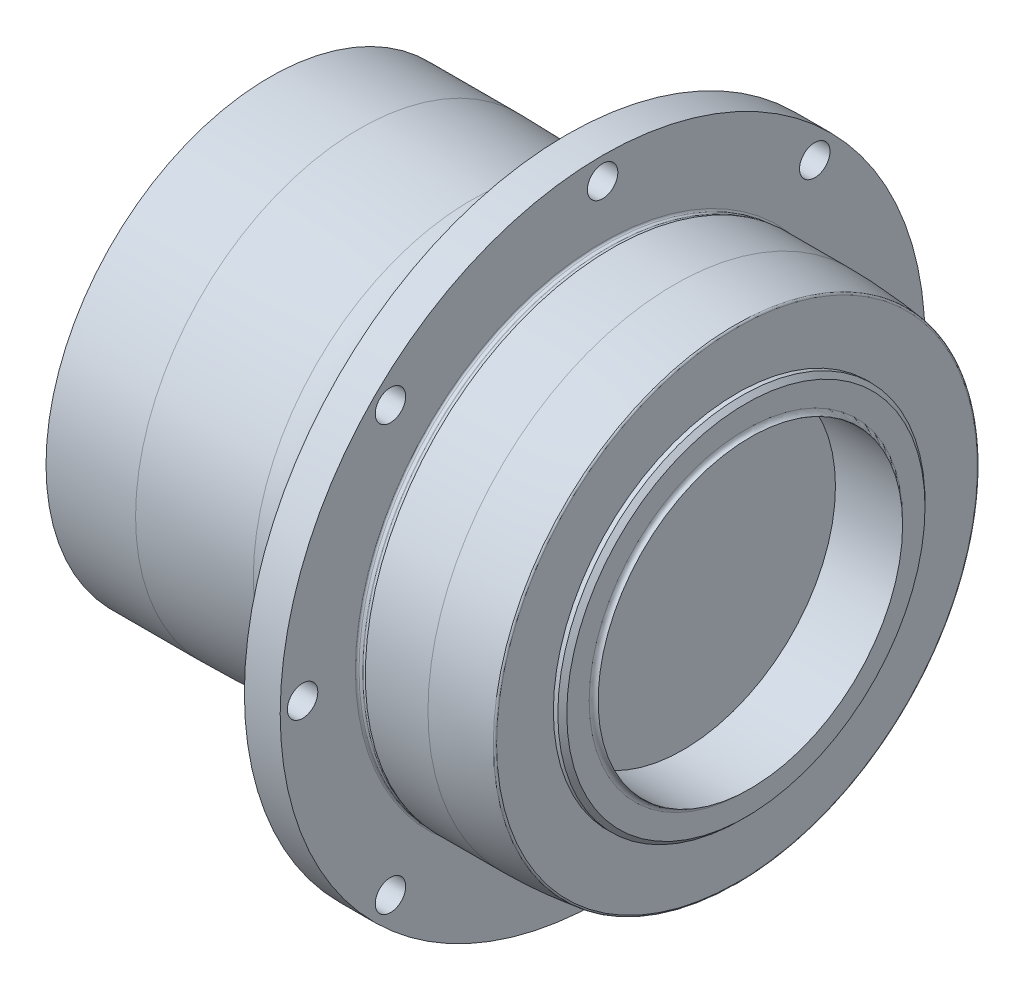
ISO-10303-21;
HEADER;
FILE_DESCRIPTION(('STEP AP214'),'2;1');
FILE_NAME('part.step','',(''),(''),'','','');
FILE_SCHEMA(('AUTOMOTIVE_DESIGN { 1 0 10303 214 1 1 1 1 }'));
ENDSEC;
DATA;
#1=APPLICATION_CONTEXT('core data for automotive mechanical design processes');
#2=APPLICATION_PROTOCOL_DEFINITION('international standard','automotive_design',2000,#1);
#3=PRODUCT_CONTEXT('',#1,'mechanical');
#4=PRODUCT('Part','Part','',(#3));
#5=PRODUCT_RELATED_PRODUCT_CATEGORY('part','',(#4));
#6=PRODUCT_DEFINITION_FORMATION('','',#4);
#7=PRODUCT_DEFINITION_CONTEXT('part definition',#1,'design');
#8=PRODUCT_DEFINITION('design','',#6,#7);
#9=PRODUCT_DEFINITION_SHAPE('','',#8);
#10=(LENGTH_UNIT() NAMED_UNIT(*) SI_UNIT(.MILLI.,.METRE.));
#11=(NAMED_UNIT(*) PLANE_ANGLE_UNIT() SI_UNIT($,.RADIAN.));
#12=(NAMED_UNIT(*) SI_UNIT($,.STERADIAN.) SOLID_ANGLE_UNIT());
#13=UNCERTAINTY_MEASURE_WITH_UNIT(LENGTH_MEASURE(1.E-05),#10,'distance_accuracy_value','');
#14=(GEOMETRIC_REPRESENTATION_CONTEXT(3) GLOBAL_UNCERTAINTY_ASSIGNED_CONTEXT((#13)) GLOBAL_UNIT_ASSIGNED_CONTEXT((#10,
#11,#12)) REPRESENTATION_CONTEXT('',''));
#15=CARTESIAN_POINT('',(0.,0.,0.));
#16=DIRECTION('',(0.,0.,1.));
#17=DIRECTION('',(1.,0.,0.));
#18=AXIS2_PLACEMENT_3D('',#15,#16,#17);
#19=CARTESIAN_POINT('',(46.15,0.,0.));
#20=DIRECTION('',(-1.,0.,0.));
#21=DIRECTION('',(0.,0.,1.));
#22=AXIS2_PLACEMENT_3D('',#19,#20,#21);
#23=PLANE('',#22);
#24=CARTESIAN_POINT('',(46.15,0.,0.));
#25=DIRECTION('',(1.,0.,0.));
#26=DIRECTION('',(0.,0.,-1.));
#27=AXIS2_PLACEMENT_3D('',#24,#25,#26);
#28=CIRCLE('',#27,17.);
#29=CARTESIAN_POINT('',(46.15,0.,-17.));
#30=VERTEX_POINT('',#29);
#31=EDGE_CURVE('E178',#30,#30,#28,.T.);
#32=ORIENTED_EDGE('',*,*,#31,.T.);
#33=EDGE_LOOP('',(#32));
#34=FACE_BOUND('',#33,.T.);
#35=ADVANCED_FACE('F16',(#34),#23,.F.);
#36=CARTESIAN_POINT('',(56.15,0.,0.));
#37=DIRECTION('',(1.,0.,0.));
#38=DIRECTION('',(0.,0.,-1.));
#39=AXIS2_PLACEMENT_3D('',#36,#37,#38);
#40=CYLINDRICAL_SURFACE('',#39,17.);
#41=CARTESIAN_POINT('',(53.65,0.,0.));
#42=DIRECTION('',(-1.,0.,0.));
#43=DIRECTION('',(0.,0.,-1.));
#44=AXIS2_PLACEMENT_3D('',#41,#42,#43);
#45=CIRCLE('',#44,17.);
#46=CARTESIAN_POINT('',(53.65,0.,-17.));
#47=VERTEX_POINT('',#46);
#48=EDGE_CURVE('E73',#47,#47,#45,.F.);
#49=ORIENTED_EDGE('',*,*,#48,.T.);
#50=EDGE_LOOP('',(#49));
#51=FACE_BOUND('',#50,.T.);
#52=ORIENTED_EDGE('',*,*,#31,.F.);
#53=EDGE_LOOP('',(#52));
#54=FACE_BOUND('',#53,.T.);
#55=ADVANCED_FACE('F693',(#51,#54),#40,.F.);
#56=CARTESIAN_POINT('',(53.65,0.,0.));
#57=DIRECTION('',(-1.,0.,0.));
#58=DIRECTION('',(0.,0.,-1.));
#59=AXIS2_PLACEMENT_3D('',#56,#57,#58);
#60=TOROIDAL_SURFACE('',#59,17.5,0.5);
#61=ORIENTED_EDGE('',*,*,#48,.F.);
#62=EDGE_LOOP('',(#61));
#63=FACE_BOUND('',#62,.T.);
#64=CARTESIAN_POINT('',(53.15,0.,0.));
#65=DIRECTION('',(1.,0.,0.));
#66=DIRECTION('',(0.,0.,-1.));
#67=AXIS2_PLACEMENT_3D('',#64,#65,#66);
#68=CIRCLE('',#67,17.5);
#69=CARTESIAN_POINT('',(53.15,0.,-17.5));
#70=VERTEX_POINT('',#69);
#71=CARTESIAN_POINT('',(53.15,0.,17.5));
#72=VERTEX_POINT('',#71);
#73=EDGE_CURVE('E58',#70,#72,#68,.T.);
#74=ORIENTED_EDGE('',*,*,#73,.T.);
#75=CARTESIAN_POINT('',(53.15,0.,0.));
#76=DIRECTION('',(1.,0.,0.));
#77=DIRECTION('',(0.,0.,1.));
#78=AXIS2_PLACEMENT_3D('',#75,#76,#77);
#79=CIRCLE('',#78,17.5);
#80=EDGE_CURVE('E61',#72,#70,#79,.T.);
#81=ORIENTED_EDGE('',*,*,#80,.T.);
#82=EDGE_LOOP('',(#74,#81));
#83=FACE_BOUND('',#82,.T.);
#84=ADVANCED_FACE('F71',(#63,#83),#60,.F.);
#85=CARTESIAN_POINT('',(53.15,-20.5,0.));
#86=DIRECTION('',(-1.,0.,0.));
#87=DIRECTION('',(0.,0.,1.));
#88=AXIS2_PLACEMENT_3D('',#85,#86,#87);
#89=PLANE('',#88);
#90=ORIENTED_EDGE('',*,*,#73,.F.);
#91=ORIENTED_EDGE('',*,*,#80,.F.);
#92=EDGE_LOOP('',(#90,#91));
#93=FACE_BOUND('',#92,.T.);
#94=CARTESIAN_POINT('',(53.15,0.,0.));
#95=DIRECTION('',(-1.,0.,0.));
#96=DIRECTION('',(0.,0.,1.));
#97=AXIS2_PLACEMENT_3D('',#94,#95,#96);
#98=CIRCLE('',#97,20.);
#99=CARTESIAN_POINT('',(53.15,0.,20.));
#100=VERTEX_POINT('',#99);
#101=EDGE_CURVE('E68',#100,#100,#98,.T.);
#102=ORIENTED_EDGE('',*,*,#101,.F.);
#103=EDGE_LOOP('',(#102));
#104=FACE_BOUND('',#103,.T.);
#105=ADVANCED_FACE('F63',(#93,#104),#89,.F.);
#106=CARTESIAN_POINT('',(52.65,0.,0.));
#107=DIRECTION('',(-1.,0.,0.));
#108=DIRECTION('',(0.,0.,1.));
#109=AXIS2_PLACEMENT_3D('',#106,#107,#108);
#110=CONICAL_SURFACE('',#109,20.5,0.785398163397448);
#111=ORIENTED_EDGE('',*,*,#101,.T.);
#112=EDGE_LOOP('',(#111));
#113=FACE_BOUND('',#112,.T.);
#114=CARTESIAN_POINT('',(52.65,0.,0.));
#115=DIRECTION('',(-1.,0.,0.));
#116=DIRECTION('',(0.,0.,1.));
#117=AXIS2_PLACEMENT_3D('',#114,#115,#116);
#118=CIRCLE('',#117,20.5);
#119=CARTESIAN_POINT('',(52.65,0.,20.5));
#120=VERTEX_POINT('',#119);
#121=EDGE_CURVE('E135',#120,#120,#118,.T.);
#122=ORIENTED_EDGE('',*,*,#121,.F.);
#123=EDGE_LOOP('',(#122));
#124=FACE_BOUND('',#123,.T.);
#125=ADVANCED_FACE('F155',(#113,#124),#110,.T.);
#126=CARTESIAN_POINT('',(20.85,0.,0.));
#127=DIRECTION('',(-1.,0.,0.));
#128=DIRECTION('',(0.,0.,1.));
#129=AXIS2_PLACEMENT_3D('',#126,#127,#128);
#130=CYLINDRICAL_SURFACE('',#129,20.5);
#131=CARTESIAN_POINT('',(52.15,0.,0.));
#132=DIRECTION('',(-1.,0.,0.));
#133=DIRECTION('',(0.,0.,1.));
#134=AXIS2_PLACEMENT_3D('',#131,#132,#133);
#135=CIRCLE('',#134,20.5);
#136=CARTESIAN_POINT('',(52.15,0.,20.5));
#137=VERTEX_POINT('',#136);
#138=EDGE_CURVE('E143',#137,#137,#135,.F.);
#139=ORIENTED_EDGE('',*,*,#138,.T.);
#140=EDGE_LOOP('',(#139));
#141=FACE_BOUND('',#140,.T.);
#142=ORIENTED_EDGE('',*,*,#121,.T.);
#143=EDGE_LOOP('',(#142));
#144=FACE_BOUND('',#143,.T.);
#145=ADVANCED_FACE('F657',(#141,#144),#130,.T.);
#146=CARTESIAN_POINT('',(52.15,21.,0.));
#147=DIRECTION('',(-1.,0.,0.));
#148=DIRECTION('',(0.,0.,1.));
#149=AXIS2_PLACEMENT_3D('',#146,#147,#148);
#150=PLANE('',#149);
#151=CARTESIAN_POINT('',(52.15,0.,0.));
#152=DIRECTION('',(-1.,0.,0.));
#153=DIRECTION('',(0.,0.,1.));
#154=AXIS2_PLACEMENT_3D('',#151,#152,#153);
#155=CIRCLE('',#154,26.8335585580444);
#156=CARTESIAN_POINT('',(52.15,0.,26.8335585580444));
#157=VERTEX_POINT('',#156);
#158=CARTESIAN_POINT('',(52.15,0.,-26.8335585580444));
#159=VERTEX_POINT('',#158);
#160=EDGE_CURVE('E112',#157,#159,#155,.T.);
#161=ORIENTED_EDGE('',*,*,#160,.F.);
#162=CARTESIAN_POINT('',(52.15,0.,0.));
#163=DIRECTION('',(-1.,0.,0.));
#164=DIRECTION('',(0.,0.,-1.));
#165=AXIS2_PLACEMENT_3D('',#162,#163,#164);
#166=CIRCLE('',#165,26.8335585580444);
#167=EDGE_CURVE('E108',#159,#157,#166,.T.);
#168=ORIENTED_EDGE('',*,*,#167,.F.);
#169=EDGE_LOOP('',(#161,#168));
#170=FACE_BOUND('',#169,.T.);
#171=ORIENTED_EDGE('',*,*,#138,.F.);
#172=EDGE_LOOP('',(#171));
#173=FACE_BOUND('',#172,.T.);
#174=ADVANCED_FACE('F92',(#170,#173),#150,.F.);
#175=CARTESIAN_POINT('',(51.95,0.,0.));
#176=DIRECTION('',(-1.,0.,0.));
#177=DIRECTION('',(0.,0.,1.));
#178=AXIS2_PLACEMENT_3D('',#175,#176,#177);
#179=TOROIDAL_SURFACE('',#178,26.8335585580444,0.2);
#180=CARTESIAN_POINT('',(51.9773092369478,0.,0.));
#181=DIRECTION('',(-1.,0.,0.));
#182=DIRECTION('',(0.,0.,1.));
#183=AXIS2_PLACEMENT_3D('',#180,#181,#182);
#184=CIRCLE('',#183,27.0316852992414);
#185=CARTESIAN_POINT('',(51.9773092369478,0.,27.0316852992414));
#186=VERTEX_POINT('',#185);
#187=EDGE_CURVE('E104',#186,#186,#184,.T.);
#188=ORIENTED_EDGE('',*,*,#187,.F.);
#189=EDGE_LOOP('',(#188));
#190=FACE_BOUND('',#189,.T.);
#191=ORIENTED_EDGE('',*,*,#167,.T.);
#192=ORIENTED_EDGE('',*,*,#160,.T.);
#193=EDGE_LOOP('',(#191,#192));
#194=FACE_BOUND('',#193,.T.);
#195=ADVANCED_FACE('F80',(#190,#194),#179,.T.);
#196=CARTESIAN_POINT('',(45.15,0.,-22.5));
#197=DIRECTION('',(0.,1.,0.));
#198=DIRECTION('',(0.,0.,1.));
#199=AXIS2_PLACEMENT_3D('',#196,#197,#198);
#200=CIRCLE('',#199,50.);
#201=TRIMMED_CURVE('',#200,(PARAMETER_VALUE(-1.1040309877476)),
(PARAMETER_VALUE(1.1040309877476)),.T.,.PARAMETER.);
#202=CARTESIAN_POINT('',(45.15,0.,0.));
#203=DIRECTION('',(-1.,0.,0.));
#204=AXIS1_PLACEMENT('',#202,#203);
#205=SURFACE_OF_REVOLUTION('',#201,#204);
#206=CARTESIAN_POINT('',(45.15,0.,0.));
#207=DIRECTION('',(1.,0.,0.));
#208=DIRECTION('',(0.,0.,-1.));
#209=AXIS2_PLACEMENT_3D('',#206,#207,#208);
#210=CIRCLE('',#209,27.5);
#211=CARTESIAN_POINT('',(45.15,0.,-27.5));
#212=VERTEX_POINT('',#211);
#213=EDGE_CURVE('E103',#212,#212,#210,.F.);
#214=ORIENTED_EDGE('',*,*,#213,.F.);
#215=EDGE_LOOP('',(#214));
#216=FACE_BOUND('',#215,.T.);
#217=ORIENTED_EDGE('',*,*,#187,.T.);
#218=EDGE_LOOP('',(#217));
#219=FACE_BOUND('',#218,.T.);
#220=ADVANCED_FACE('F91',(#216,#219),#205,.F.);
#221=CARTESIAN_POINT('',(0.,0.,0.));
#222=DIRECTION('',(1.,0.,0.));
#223=DIRECTION('',(0.,0.,-1.));
#224=AXIS2_PLACEMENT_3D('',#221,#222,#223);
#225=CYLINDRICAL_SURFACE('',#224,27.5);
#226=CARTESIAN_POINT('',(38.15,0.,0.));
#227=DIRECTION('',(1.,0.,0.));
#228=DIRECTION('',(0.,0.,-1.));
#229=AXIS2_PLACEMENT_3D('',#226,#227,#228);
#230=CIRCLE('',#229,27.5);
#231=CARTESIAN_POINT('',(38.15,0.,-27.5));
#232=VERTEX_POINT('',#231);
#233=EDGE_CURVE('E382',#232,#232,#230,.F.);
#234=ORIENTED_EDGE('',*,*,#233,.F.);
#235=EDGE_LOOP('',(#234));
#236=FACE_BOUND('',#235,.T.);
#237=ORIENTED_EDGE('',*,*,#213,.T.);
#238=EDGE_LOOP('',(#237));
#239=FACE_BOUND('',#238,.T.);
#240=ADVANCED_FACE('F316',(#236,#239),#225,.T.);
#241=CARTESIAN_POINT('',(38.15,0.,0.));
#242=DIRECTION('',(1.,0.,0.));
#243=DIRECTION('',(0.,0.,-1.));
#244=AXIS2_PLACEMENT_3D('',#241,#242,#243);
#245=CONICAL_SURFACE('',#244,27.5,0.261799387799154);
#246=ORIENTED_EDGE('',*,*,#233,.T.);
#247=EDGE_LOOP('',(#246));
#248=FACE_BOUND('',#247,.T.);
#249=CARTESIAN_POINT('',(37.8022282287461,0.,0.));
#250=DIRECTION('',(-1.,0.,0.));
#251=DIRECTION('',(0.,0.,1.));
#252=AXIS2_PLACEMENT_3D('',#249,#250,#251);
#253=CIRCLE('',#252,27.4068148347422);
#254=CARTESIAN_POINT('',(37.8022282287461,0.,27.4068148347422));
#255=VERTEX_POINT('',#254);
#256=EDGE_CURVE('E379',#255,#255,#253,.F.);
#257=ORIENTED_EDGE('',*,*,#256,.T.);
#258=EDGE_LOOP('',(#257));
#259=FACE_BOUND('',#258,.T.);
#260=ADVANCED_FACE('F313',(#248,#259),#245,.T.);
#261=CARTESIAN_POINT('',(37.7504644197257,0.,0.));
#262=DIRECTION('',(-1.,0.,0.));
#263=DIRECTION('',(0.,0.,1.));
#264=AXIS2_PLACEMENT_3D('',#261,#262,#263);
#265=TOROIDAL_SURFACE('',#264,27.6,0.200000000000003);
#266=CARTESIAN_POINT('',(37.7504644197257,0.,0.));
#267=DIRECTION('',(1.,0.,0.));
#268=DIRECTION('',(0.,0.,-1.));
#269=AXIS2_PLACEMENT_3D('',#266,#267,#268);
#270=CIRCLE('',#269,27.4);
#271=CARTESIAN_POINT('',(37.7504644197257,0.,-27.4));
#272=VERTEX_POINT('',#271);
#273=EDGE_CURVE('E306',#272,#272,#270,.F.);
#274=ORIENTED_EDGE('',*,*,#273,.F.);
#275=EDGE_LOOP('',(#274));
#276=FACE_BOUND('',#275,.T.);
#277=ORIENTED_EDGE('',*,*,#256,.F.);
#278=EDGE_LOOP('',(#277));
#279=FACE_BOUND('',#278,.T.);
#280=ADVANCED_FACE('F310',(#276,#279),#265,.F.);
#281=CARTESIAN_POINT('',(38.15,0.,0.));
#282=DIRECTION('',(1.,0.,0.));
#283=DIRECTION('',(0.,0.,-1.));
#284=AXIS2_PLACEMENT_3D('',#281,#282,#283);
#285=CYLINDRICAL_SURFACE('',#284,27.4);
#286=CARTESIAN_POINT('',(37.35,0.,0.));
#287=DIRECTION('',(-1.,0.,0.));
#288=DIRECTION('',(0.,0.,1.));
#289=AXIS2_PLACEMENT_3D('',#286,#287,#288);
#290=CIRCLE('',#289,27.4);
#291=CARTESIAN_POINT('',(37.35,0.,27.4));
#292=VERTEX_POINT('',#291);
#293=EDGE_CURVE('E297',#292,#292,#290,.F.);
#294=ORIENTED_EDGE('',*,*,#293,.T.);
#295=EDGE_LOOP('',(#294));
#296=FACE_BOUND('',#295,.T.);
#297=ORIENTED_EDGE('',*,*,#273,.T.);
#298=EDGE_LOOP('',(#297));
#299=FACE_BOUND('',#298,.T.);
#300=ADVANCED_FACE('F283',(#296,#299),#285,.T.);
#301=CARTESIAN_POINT('',(37.35,0.,0.));
#302=DIRECTION('',(-1.,0.,0.));
#303=DIRECTION('',(0.,0.,1.));
#304=AXIS2_PLACEMENT_3D('',#301,#302,#303);
#305=TOROIDAL_SURFACE('',#304,27.6,0.199999999999996);
#306=CARTESIAN_POINT('',(37.15,0.,0.));
#307=DIRECTION('',(1.,0.,0.));
#308=DIRECTION('',(0.,0.,1.));
#309=AXIS2_PLACEMENT_3D('',#306,#307,#308);
#310=CIRCLE('',#309,27.6);
#311=CARTESIAN_POINT('',(37.15,0.,27.6));
#312=VERTEX_POINT('',#311);
#313=CARTESIAN_POINT('',(37.15,0.,-27.6));
#314=VERTEX_POINT('',#313);
#315=EDGE_CURVE('E39',#312,#314,#310,.T.);
#316=ORIENTED_EDGE('',*,*,#315,.T.);
#317=CARTESIAN_POINT('',(37.15,0.,0.));
#318=DIRECTION('',(1.,0.,0.));
#319=DIRECTION('',(0.,0.,-1.));
#320=AXIS2_PLACEMENT_3D('',#317,#318,#319);
#321=CIRCLE('',#320,27.6);
#322=EDGE_CURVE('E267',#314,#312,#321,.T.);
#323=ORIENTED_EDGE('',*,*,#322,.T.);
#324=EDGE_LOOP('',(#316,#323));
#325=FACE_BOUND('',#324,.T.);
#326=ORIENTED_EDGE('',*,*,#293,.F.);
#327=EDGE_LOOP('',(#326));
#328=FACE_BOUND('',#327,.T.);
#329=ADVANCED_FACE('F271',(#325,#328),#305,.F.);
#330=CARTESIAN_POINT('',(37.15,27.5,0.));
#331=DIRECTION('',(-1.,0.,0.));
#332=DIRECTION('',(0.,0.,1.));
#333=AXIS2_PLACEMENT_3D('',#330,#331,#332);
#334=PLANE('',#333);
#335=ORIENTED_EDGE('',*,*,#322,.F.);
#336=ORIENTED_EDGE('',*,*,#315,.F.);
#337=EDGE_LOOP('',(#335,#336));
#338=FACE_BOUND('',#337,.T.);
#339=CARTESIAN_POINT('',(37.15,23.6880771697495,23.6880771697492));
#340=DIRECTION('',(1.,0.,0.));
#341=DIRECTION('',(0.,0.,-1.));
#342=AXIS2_PLACEMENT_3D('',#339,#340,#341);
#343=CIRCLE('',#342,1.7);
#344=CARTESIAN_POINT('',(37.15,23.6880771697495,21.9880771697492));
#345=VERTEX_POINT('',#344);
#346=EDGE_CURVE('E253',#345,#345,#343,.F.);
#347=ORIENTED_EDGE('',*,*,#346,.T.);
#348=EDGE_LOOP('',(#347));
#349=FACE_BOUND('',#348,.T.);
#350=CARTESIAN_POINT('',(37.15,33.5,-1.25169758405532E-13));
#351=DIRECTION('',(1.,0.,0.));
#352=DIRECTION('',(0.,0.,-1.));
#353=AXIS2_PLACEMENT_3D('',#350,#351,#352);
#354=CIRCLE('',#353,1.7);
#355=CARTESIAN_POINT('',(37.15,33.5,-1.70000000000012));
#356=VERTEX_POINT('',#355);
#357=EDGE_CURVE('E249',#356,#356,#354,.F.);
#358=ORIENTED_EDGE('',*,*,#357,.T.);
#359=EDGE_LOOP('',(#358));
#360=FACE_BOUND('',#359,.T.);
#361=CARTESIAN_POINT('',(37.15,23.6880771697493,-23.6880771697494));
#362=DIRECTION('',(1.,0.,0.));
#363=DIRECTION('',(0.,0.,-1.));
#364=AXIS2_PLACEMENT_3D('',#361,#362,#363);
#365=CIRCLE('',#364,1.7);
#366=CARTESIAN_POINT('',(37.15,23.6880771697493,-25.3880771697494));
#367=VERTEX_POINT('',#366);
#368=EDGE_CURVE('E245',#367,#367,#365,.F.);
#369=ORIENTED_EDGE('',*,*,#368,.T.);
#370=EDGE_LOOP('',(#369));
#371=FACE_BOUND('',#370,.T.);
#372=CARTESIAN_POINT('',(37.15,0.,-33.5));
#373=DIRECTION('',(1.,0.,0.));
#374=DIRECTION('',(0.,0.,-1.));
#375=AXIS2_PLACEMENT_3D('',#372,#373,#374);
#376=CIRCLE('',#375,1.7);
#377=CARTESIAN_POINT('',(37.15,0.,-35.2));
#378=VERTEX_POINT('',#377);
#379=EDGE_CURVE('E241',#378,#378,#376,.F.);
#380=ORIENTED_EDGE('',*,*,#379,.T.);
#381=EDGE_LOOP('',(#380));
#382=FACE_BOUND('',#381,.T.);
#383=CARTESIAN_POINT('',(37.15,-23.6880771697494,-23.6880771697493));
#384=DIRECTION('',(1.,0.,0.));
#385=DIRECTION('',(0.,0.,-1.));
#386=AXIS2_PLACEMENT_3D('',#383,#384,#385);
#387=CIRCLE('',#386,1.7);
#388=CARTESIAN_POINT('',(37.15,-23.6880771697494,-25.3880771697493));
#389=VERTEX_POINT('',#388);
#390=EDGE_CURVE('E237',#389,#389,#387,.F.);
#391=ORIENTED_EDGE('',*,*,#390,.T.);
#392=EDGE_LOOP('',(#391));
#393=FACE_BOUND('',#392,.T.);
#394=CARTESIAN_POINT('',(37.15,-33.5,0.));
#395=DIRECTION('',(1.,0.,0.));
#396=DIRECTION('',(0.,0.,-1.));
#397=AXIS2_PLACEMENT_3D('',#394,#395,#396);
#398=CIRCLE('',#397,1.7);
#399=CARTESIAN_POINT('',(37.15,-33.5,-1.69999999999996));
#400=VERTEX_POINT('',#399);
#401=EDGE_CURVE('E233',#400,#400,#398,.F.);
#402=ORIENTED_EDGE('',*,*,#401,.T.);
#403=EDGE_LOOP('',(#402));
#404=FACE_BOUND('',#403,.T.);
#405=CARTESIAN_POINT('',(37.15,-23.6880771697493,23.6880771697494));
#406=DIRECTION('',(1.,0.,0.));
#407=DIRECTION('',(0.,0.,-1.));
#408=AXIS2_PLACEMENT_3D('',#405,#406,#407);
#409=CIRCLE('',#408,1.7);
#410=CARTESIAN_POINT('',(37.15,-23.6880771697493,21.9880771697494));
#411=VERTEX_POINT('',#410);
#412=EDGE_CURVE('E229',#411,#411,#409,.F.);
#413=ORIENTED_EDGE('',*,*,#412,.T.);
#414=EDGE_LOOP('',(#413));
#415=FACE_BOUND('',#414,.T.);
#416=CARTESIAN_POINT('',(37.15,0.,33.5));
#417=DIRECTION('',(1.,0.,0.));
#418=DIRECTION('',(0.,0.,-1.));
#419=AXIS2_PLACEMENT_3D('',#416,#417,#418);
#420=CIRCLE('',#419,1.7);
#421=CARTESIAN_POINT('',(37.15,0.,31.8));
#422=VERTEX_POINT('',#421);
#423=EDGE_CURVE('E225',#422,#422,#420,.F.);
#424=ORIENTED_EDGE('',*,*,#423,.T.);
#425=EDGE_LOOP('',(#424));
#426=FACE_BOUND('',#425,.T.);
#427=CARTESIAN_POINT('',(37.15,0.,0.));
#428=DIRECTION('',(1.,0.,0.));
#429=DIRECTION('',(0.,0.,-1.));
#430=AXIS2_PLACEMENT_3D('',#427,#428,#429);
#431=CIRCLE('',#430,36.);
#432=CARTESIAN_POINT('',(37.15,0.,-36.));
#433=VERTEX_POINT('',#432);
#434=EDGE_CURVE('E221',#433,#433,#431,.F.);
#435=ORIENTED_EDGE('',*,*,#434,.F.);
#436=EDGE_LOOP('',(#435));
#437=FACE_BOUND('',#436,.T.);
#438=ADVANCED_FACE('F282',(#338,#349,#360,#371,#382,#393,#404,#415,#426,#437),#334,.F.);
#439=CARTESIAN_POINT('',(37.15,23.6880771697495,23.6880771697492));
#440=DIRECTION('',(1.,0.,0.));
#441=DIRECTION('',(0.,0.,-1.));
#442=AXIS2_PLACEMENT_3D('',#439,#440,#441);
#443=CYLINDRICAL_SURFACE('',#442,1.7);
#444=CARTESIAN_POINT('',(33.15,23.6880771697495,23.6880771697492));
#445=DIRECTION('',(1.,0.,0.));
#446=DIRECTION('',(0.,0.,-1.));
#447=AXIS2_PLACEMENT_3D('',#444,#445,#446);
#448=CIRCLE('',#447,1.7);
#449=CARTESIAN_POINT('',(33.15,23.6880771697495,21.9880771697492));
#450=VERTEX_POINT('',#449);
#451=EDGE_CURVE('E217',#450,#450,#448,.F.);
#452=ORIENTED_EDGE('',*,*,#451,.T.);
#453=EDGE_LOOP('',(#452));
#454=FACE_BOUND('',#453,.T.);
#455=ORIENTED_EDGE('',*,*,#346,.F.);
#456=EDGE_LOOP('',(#455));
#457=FACE_BOUND('',#456,.T.);
#458=ADVANCED_FACE('F419',(#454,#457),#443,.F.);
#459=CARTESIAN_POINT('',(37.15,33.5,-1.25169758405532E-13));
#460=DIRECTION('',(1.,0.,0.));
#461=DIRECTION('',(0.,0.,-1.));
#462=AXIS2_PLACEMENT_3D('',#459,#460,#461);
#463=CYLINDRICAL_SURFACE('',#462,1.7);
#464=CARTESIAN_POINT('',(33.15,33.5,-1.25169758405532E-13));
#465=DIRECTION('',(1.,0.,0.));
#466=DIRECTION('',(0.,0.,-1.));
#467=AXIS2_PLACEMENT_3D('',#464,#465,#466);
#468=CIRCLE('',#467,1.7);
#469=CARTESIAN_POINT('',(33.15,33.5,-1.70000000000012));
#470=VERTEX_POINT('',#469);
#471=EDGE_CURVE('E213',#470,#470,#468,.F.);
#472=ORIENTED_EDGE('',*,*,#471,.T.);
#473=EDGE_LOOP('',(#472));
#474=FACE_BOUND('',#473,.T.);
#475=ORIENTED_EDGE('',*,*,#357,.F.);
#476=EDGE_LOOP('',(#475));
#477=FACE_BOUND('',#476,.T.);
#478=ADVANCED_FACE('F425',(#474,#477),#463,.F.);
#479=CARTESIAN_POINT('',(37.15,23.6880771697493,-23.6880771697494));
#480=DIRECTION('',(1.,0.,0.));
#481=DIRECTION('',(0.,0.,-1.));
#482=AXIS2_PLACEMENT_3D('',#479,#480,#481);
#483=CYLINDRICAL_SURFACE('',#482,1.7);
#484=CARTESIAN_POINT('',(33.15,23.6880771697493,-23.6880771697494));
#485=DIRECTION('',(1.,0.,0.));
#486=DIRECTION('',(0.,0.,-1.));
#487=AXIS2_PLACEMENT_3D('',#484,#485,#486);
#488=CIRCLE('',#487,1.7);
#489=CARTESIAN_POINT('',(33.15,23.6880771697493,-25.3880771697494));
#490=VERTEX_POINT('',#489);
#491=EDGE_CURVE('E209',#490,#490,#488,.F.);
#492=ORIENTED_EDGE('',*,*,#491,.T.);
#493=EDGE_LOOP('',(#492));
#494=FACE_BOUND('',#493,.T.);
#495=ORIENTED_EDGE('',*,*,#368,.F.);
#496=EDGE_LOOP('',(#495));
#497=FACE_BOUND('',#496,.T.);
#498=ADVANCED_FACE('F432',(#494,#497),#483,.F.);
#499=CARTESIAN_POINT('',(37.15,0.,-33.5));
#500=DIRECTION('',(1.,0.,0.));
#501=DIRECTION('',(0.,0.,-1.));
#502=AXIS2_PLACEMENT_3D('',#499,#500,#501);
#503=CYLINDRICAL_SURFACE('',#502,1.7);
#504=CARTESIAN_POINT('',(33.15,0.,-33.5));
#505=DIRECTION('',(1.,0.,0.));
#506=DIRECTION('',(0.,0.,-1.));
#507=AXIS2_PLACEMENT_3D('',#504,#505,#506);
#508=CIRCLE('',#507,1.7);
#509=CARTESIAN_POINT('',(33.15,0.,-35.2));
#510=VERTEX_POINT('',#509);
#511=EDGE_CURVE('E205',#510,#510,#508,.F.);
#512=ORIENTED_EDGE('',*,*,#511,.T.);
#513=EDGE_LOOP('',(#512));
#514=FACE_BOUND('',#513,.T.);
#515=ORIENTED_EDGE('',*,*,#379,.F.);
#516=EDGE_LOOP('',(#515));
#517=FACE_BOUND('',#516,.T.);
#518=ADVANCED_FACE('F440',(#514,#517),#503,.F.);
#519=CARTESIAN_POINT('',(37.15,-23.6880771697494,-23.6880771697493));
#520=DIRECTION('',(1.,0.,0.));
#521=DIRECTION('',(0.,0.,-1.));
#522=AXIS2_PLACEMENT_3D('',#519,#520,#521);
#523=CYLINDRICAL_SURFACE('',#522,1.7);
#524=CARTESIAN_POINT('',(33.15,-23.6880771697494,-23.6880771697493));
#525=DIRECTION('',(1.,0.,0.));
#526=DIRECTION('',(0.,0.,-1.));
#527=AXIS2_PLACEMENT_3D('',#524,#525,#526);
#528=CIRCLE('',#527,1.7);
#529=CARTESIAN_POINT('',(33.15,-23.6880771697494,-25.3880771697493));
#530=VERTEX_POINT('',#529);
#531=EDGE_CURVE('E201',#530,#530,#528,.F.);
#532=ORIENTED_EDGE('',*,*,#531,.T.);
#533=EDGE_LOOP('',(#532));
#534=FACE_BOUND('',#533,.T.);
#535=ORIENTED_EDGE('',*,*,#390,.F.);
#536=EDGE_LOOP('',(#535));
#537=FACE_BOUND('',#536,.T.);
#538=ADVANCED_FACE('F448',(#534,#537),#523,.F.);
#539=CARTESIAN_POINT('',(37.15,-33.5,0.));
#540=DIRECTION('',(1.,0.,0.));
#541=DIRECTION('',(0.,0.,-1.));
#542=AXIS2_PLACEMENT_3D('',#539,#540,#541);
#543=CYLINDRICAL_SURFACE('',#542,1.7);
#544=CARTESIAN_POINT('',(33.15,-33.5,0.));
#545=DIRECTION('',(1.,0.,0.));
#546=DIRECTION('',(0.,0.,-1.));
#547=AXIS2_PLACEMENT_3D('',#544,#545,#546);
#548=CIRCLE('',#547,1.7);
#549=CARTESIAN_POINT('',(33.15,-33.5,-1.69999999999996));
#550=VERTEX_POINT('',#549);
#551=EDGE_CURVE('E197',#550,#550,#548,.F.);
#552=ORIENTED_EDGE('',*,*,#551,.T.);
#553=EDGE_LOOP('',(#552));
#554=FACE_BOUND('',#553,.T.);
#555=ORIENTED_EDGE('',*,*,#401,.F.);
#556=EDGE_LOOP('',(#555));
#557=FACE_BOUND('',#556,.T.);
#558=ADVANCED_FACE('F456',(#554,#557),#543,.F.);
#559=CARTESIAN_POINT('',(37.15,-23.6880771697493,23.6880771697494));
#560=DIRECTION('',(1.,0.,0.));
#561=DIRECTION('',(0.,0.,-1.));
#562=AXIS2_PLACEMENT_3D('',#559,#560,#561);
#563=CYLINDRICAL_SURFACE('',#562,1.7);
#564=CARTESIAN_POINT('',(33.15,-23.6880771697493,23.6880771697494));
#565=DIRECTION('',(1.,0.,0.));
#566=DIRECTION('',(0.,0.,-1.));
#567=AXIS2_PLACEMENT_3D('',#564,#565,#566);
#568=CIRCLE('',#567,1.7);
#569=CARTESIAN_POINT('',(33.15,-23.6880771697493,21.9880771697494));
#570=VERTEX_POINT('',#569);
#571=EDGE_CURVE('E193',#570,#570,#568,.F.);
#572=ORIENTED_EDGE('',*,*,#571,.T.);
#573=EDGE_LOOP('',(#572));
#574=FACE_BOUND('',#573,.T.);
#575=ORIENTED_EDGE('',*,*,#412,.F.);
#576=EDGE_LOOP('',(#575));
#577=FACE_BOUND('',#576,.T.);
#578=ADVANCED_FACE('F464',(#574,#577),#563,.F.);
#579=CARTESIAN_POINT('',(37.15,0.,33.5));
#580=DIRECTION('',(1.,0.,0.));
#581=DIRECTION('',(0.,0.,-1.));
#582=AXIS2_PLACEMENT_3D('',#579,#580,#581);
#583=CYLINDRICAL_SURFACE('',#582,1.7);
#584=CARTESIAN_POINT('',(33.15,0.,33.5));
#585=DIRECTION('',(1.,0.,0.));
#586=DIRECTION('',(0.,0.,-1.));
#587=AXIS2_PLACEMENT_3D('',#584,#585,#586);
#588=CIRCLE('',#587,1.7);
#589=CARTESIAN_POINT('',(33.15,0.,31.8));
#590=VERTEX_POINT('',#589);
#591=EDGE_CURVE('E189',#590,#590,#588,.F.);
#592=ORIENTED_EDGE('',*,*,#591,.T.);
#593=EDGE_LOOP('',(#592));
#594=FACE_BOUND('',#593,.T.);
#595=ORIENTED_EDGE('',*,*,#423,.F.);
#596=EDGE_LOOP('',(#595));
#597=FACE_BOUND('',#596,.T.);
#598=ADVANCED_FACE('F472',(#594,#597),#583,.F.);
#599=CARTESIAN_POINT('',(0.,0.,0.));
#600=DIRECTION('',(1.,0.,0.));
#601=DIRECTION('',(0.,0.,-1.));
#602=AXIS2_PLACEMENT_3D('',#599,#600,#601);
#603=CYLINDRICAL_SURFACE('',#602,36.);
#604=ORIENTED_EDGE('',*,*,#434,.T.);
#605=EDGE_LOOP('',(#604));
#606=FACE_BOUND('',#605,.T.);
#607=CARTESIAN_POINT('',(33.15,0.,0.));
#608=DIRECTION('',(1.,0.,0.));
#609=DIRECTION('',(0.,0.,-1.));
#610=AXIS2_PLACEMENT_3D('',#607,#608,#609);
#611=CIRCLE('',#610,36.);
#612=CARTESIAN_POINT('',(33.15,0.,-36.));
#613=VERTEX_POINT('',#612);
#614=EDGE_CURVE('E185',#613,#613,#611,.T.);
#615=ORIENTED_EDGE('',*,*,#614,.T.);
#616=EDGE_LOOP('',(#615));
#617=FACE_BOUND('',#616,.T.);
#618=ADVANCED_FACE('F480',(#606,#617),#603,.T.);
#619=CARTESIAN_POINT('',(33.15,36.,0.));
#620=DIRECTION('',(1.,0.,0.));
#621=DIRECTION('',(0.,0.,-1.));
#622=AXIS2_PLACEMENT_3D('',#619,#620,#621);
#623=PLANE('',#622);
#624=ORIENTED_EDGE('',*,*,#614,.F.);
#625=EDGE_LOOP('',(#624));
#626=FACE_BOUND('',#625,.T.);
#627=CARTESIAN_POINT('',(33.15,0.,0.));
#628=DIRECTION('',(1.,0.,0.));
#629=DIRECTION('',(0.,0.,-1.));
#630=AXIS2_PLACEMENT_3D('',#627,#628,#629);
#631=CIRCLE('',#630,26.9999999999999);
#632=CARTESIAN_POINT('',(33.15,0.,-26.9999999999999));
#633=VERTEX_POINT('',#632);
#634=EDGE_CURVE('E180',#633,#633,#631,.F.);
#635=ORIENTED_EDGE('',*,*,#634,.F.);
#636=EDGE_LOOP('',(#635));
#637=FACE_BOUND('',#636,.T.);
#638=ORIENTED_EDGE('',*,*,#591,.F.);
#639=EDGE_LOOP('',(#638));
#640=FACE_BOUND('',#639,.T.);
#641=ORIENTED_EDGE('',*,*,#571,.F.);
#642=EDGE_LOOP('',(#641));
#643=FACE_BOUND('',#642,.T.);
#644=ORIENTED_EDGE('',*,*,#551,.F.);
#645=EDGE_LOOP('',(#644));
#646=FACE_BOUND('',#645,.T.);
#647=ORIENTED_EDGE('',*,*,#531,.F.);
#648=EDGE_LOOP('',(#647));
#649=FACE_BOUND('',#648,.T.);
#650=ORIENTED_EDGE('',*,*,#511,.F.);
#651=EDGE_LOOP('',(#650));
#652=FACE_BOUND('',#651,.T.);
#653=ORIENTED_EDGE('',*,*,#491,.F.);
#654=EDGE_LOOP('',(#653));
#655=FACE_BOUND('',#654,.T.);
#656=ORIENTED_EDGE('',*,*,#471,.F.);
#657=EDGE_LOOP('',(#656));
#658=FACE_BOUND('',#657,.T.);
#659=ORIENTED_EDGE('',*,*,#451,.F.);
#660=EDGE_LOOP('',(#659));
#661=FACE_BOUND('',#660,.T.);
#662=ADVANCED_FACE('F488',(#626,#637,#640,#643,#646,#649,#652,#655,#658,#661),#623,.F.);
#663=CARTESIAN_POINT('',(0.,0.,0.));
#664=DIRECTION('',(1.,0.,0.));
#665=DIRECTION('',(0.,0.,-1.));
#666=AXIS2_PLACEMENT_3D('',#663,#664,#665);
#667=CYLINDRICAL_SURFACE('',#666,26.9999999999999);
#668=CARTESIAN_POINT('',(29.15,0.,0.));
#669=DIRECTION('',(1.,0.,0.));
#670=DIRECTION('',(0.,0.,-1.));
#671=AXIS2_PLACEMENT_3D('',#668,#669,#670);
#672=CIRCLE('',#671,26.9999999999999);
#673=CARTESIAN_POINT('',(29.15,0.,-26.9999999999999));
#674=VERTEX_POINT('',#673);
#675=EDGE_CURVE('E184',#674,#674,#672,.F.);
#676=ORIENTED_EDGE('',*,*,#675,.F.);
#677=EDGE_LOOP('',(#676));
#678=FACE_BOUND('',#677,.T.);
#679=ORIENTED_EDGE('',*,*,#634,.T.);
#680=EDGE_LOOP('',(#679));
#681=FACE_BOUND('',#680,.T.);
#682=ADVANCED_FACE('F496',(#678,#681),#667,.T.);
#683=CARTESIAN_POINT('',(29.15,0.,0.));
#684=DIRECTION('',(1.,0.,0.));
#685=DIRECTION('',(0.,1.,0.));
#686=AXIS2_PLACEMENT_3D('',#683,#684,#685);
#687=CONICAL_SURFACE('',#686,26.9999999999999,0.593411945678106);
#688=ORIENTED_EDGE('',*,*,#675,.T.);
#689=EDGE_LOOP('',(#688));
#690=FACE_BOUND('',#689,.T.);
#691=CARTESIAN_POINT('',(26.8050099582013,0.,0.));
#692=DIRECTION('',(-1.,0.,0.));
#693=DIRECTION('',(0.,0.,1.));
#694=AXIS2_PLACEMENT_3D('',#691,#692,#693);
#695=CIRCLE('',#694,25.418284244896);
#696=CARTESIAN_POINT('',(26.8050099582013,0.,25.418284244896));
#697=VERTEX_POINT('',#696);
#698=EDGE_CURVE('E357',#697,#697,#695,.F.);
#699=ORIENTED_EDGE('',*,*,#698,.T.);
#700=EDGE_LOOP('',(#699));
#701=FACE_BOUND('',#700,.T.);
#702=ADVANCED_FACE('F504',(#690,#701),#687,.T.);
#703=CARTESIAN_POINT('',(23.1702560856412,0.,0.));
#704=DIRECTION('',(-1.,0.,0.));
#705=DIRECTION('',(0.,0.,1.));
#706=AXIS2_PLACEMENT_3D('',#703,#704,#705);
#707=TOROIDAL_SURFACE('',#706,30.8070284665036,6.50000000000002);
#708=ORIENTED_EDGE('',*,*,#698,.F.);
#709=EDGE_LOOP('',(#708));
#710=FACE_BOUND('',#709,.T.);
#711=CARTESIAN_POINT('',(22.4881312684566,0.,0.));
#712=DIRECTION('',(-1.,0.,0.));
#713=DIRECTION('',(0.,0.,1.));
#714=AXIS2_PLACEMENT_3D('',#711,#712,#713);
#715=CIRCLE('',#714,24.3429194224217);
#716=CARTESIAN_POINT('',(22.4881312684566,0.,24.3429194224217));
#717=VERTEX_POINT('',#716);
#718=EDGE_CURVE('E351',#717,#717,#715,.T.);
#719=ORIENTED_EDGE('',*,*,#718,.F.);
#720=EDGE_LOOP('',(#719));
#721=FACE_BOUND('',#720,.T.);
#722=ADVANCED_FACE('F343',(#710,#721),#707,.F.);
#723=CARTESIAN_POINT('',(10.,0.,-94.));
#724=DIRECTION('',(0.,1.,0.));
#725=DIRECTION('',(0.,0.,1.));
#726=AXIS2_PLACEMENT_3D('',#723,#724,#725);
#727=CIRCLE('',#726,119.);
#728=TRIMMED_CURVE('',#727,(PARAMETER_VALUE(-0.660124379227379)),
(PARAMETER_VALUE(0.660124379227379)),.T.,.PARAMETER.);
#729=CARTESIAN_POINT('',(10.,0.,0.));
#730=DIRECTION('',(-1.,0.,0.));
#731=AXIS1_PLACEMENT('',#729,#730);
#732=SURFACE_OF_REVOLUTION('',#728,#731);
#733=CARTESIAN_POINT('',(10.,0.,0.));
#734=DIRECTION('',(1.,0.,0.));
#735=DIRECTION('',(0.,0.,-1.));
#736=AXIS2_PLACEMENT_3D('',#733,#734,#735);
#737=CIRCLE('',#736,25.);
#738=CARTESIAN_POINT('',(10.,0.,-25.));
#739=VERTEX_POINT('',#738);
#740=EDGE_CURVE('E28',#739,#739,#737,.F.);
#741=ORIENTED_EDGE('',*,*,#740,.F.);
#742=EDGE_LOOP('',(#741));
#743=FACE_BOUND('',#742,.T.);
#744=ORIENTED_EDGE('',*,*,#718,.T.);
#745=EDGE_LOOP('',(#744));
#746=FACE_BOUND('',#745,.T.);
#747=ADVANCED_FACE('F336',(#743,#746),#732,.F.);
#748=CARTESIAN_POINT('',(0.,0.,0.));
#749=DIRECTION('',(1.,0.,0.));
#750=DIRECTION('',(0.,0.,-1.));
#751=AXIS2_PLACEMENT_3D('',#748,#749,#750);
#752=CYLINDRICAL_SURFACE('',#751,25.);
#753=CARTESIAN_POINT('',(0.,0.,0.));
#754=DIRECTION('',(1.,0.,0.));
#755=DIRECTION('',(0.,0.,-1.));
#756=AXIS2_PLACEMENT_3D('',#753,#754,#755);
#757=CIRCLE('',#756,25.);
#758=CARTESIAN_POINT('',(0.,0.,-25.));
#759=VERTEX_POINT('',#758);
#760=EDGE_CURVE('E11',#759,#759,#757,.T.);
#761=ORIENTED_EDGE('',*,*,#760,.T.);
#762=EDGE_LOOP('',(#761));
#763=FACE_BOUND('',#762,.T.);
#764=ORIENTED_EDGE('',*,*,#740,.T.);
#765=EDGE_LOOP('',(#764));
#766=FACE_BOUND('',#765,.T.);
#767=ADVANCED_FACE('F330',(#763,#766),#752,.T.);
#768=CARTESIAN_POINT('',(0.,25.,0.));
#769=DIRECTION('',(1.,0.,0.));
#770=DIRECTION('',(0.,0.,-1.));
#771=AXIS2_PLACEMENT_3D('',#768,#769,#770);
#772=PLANE('',#771);
#773=ORIENTED_EDGE('',*,*,#760,.F.);
#774=EDGE_LOOP('',(#773));
#775=FACE_BOUND('',#774,.T.);
#776=ADVANCED_FACE('F328',(#775),#772,.F.);
#777=CLOSED_SHELL('',(#35,#55,#84,#105,#125,#145,#174,#195,#220,#240,#260,#280,#300,#329,#438,
#458,#478,#498,#518,#538,#558,#578,#598,#618,#662,#682,#702,#722,#747,#767,#776));
#778=MANIFOLD_SOLID_BREP('B1',#777);
#779=ADVANCED_BREP_SHAPE_REPRESENTATION('',(#18,#778),#14);
#780=SHAPE_DEFINITION_REPRESENTATION(#9,#779);
ENDSEC;
END-ISO-10303-21;
